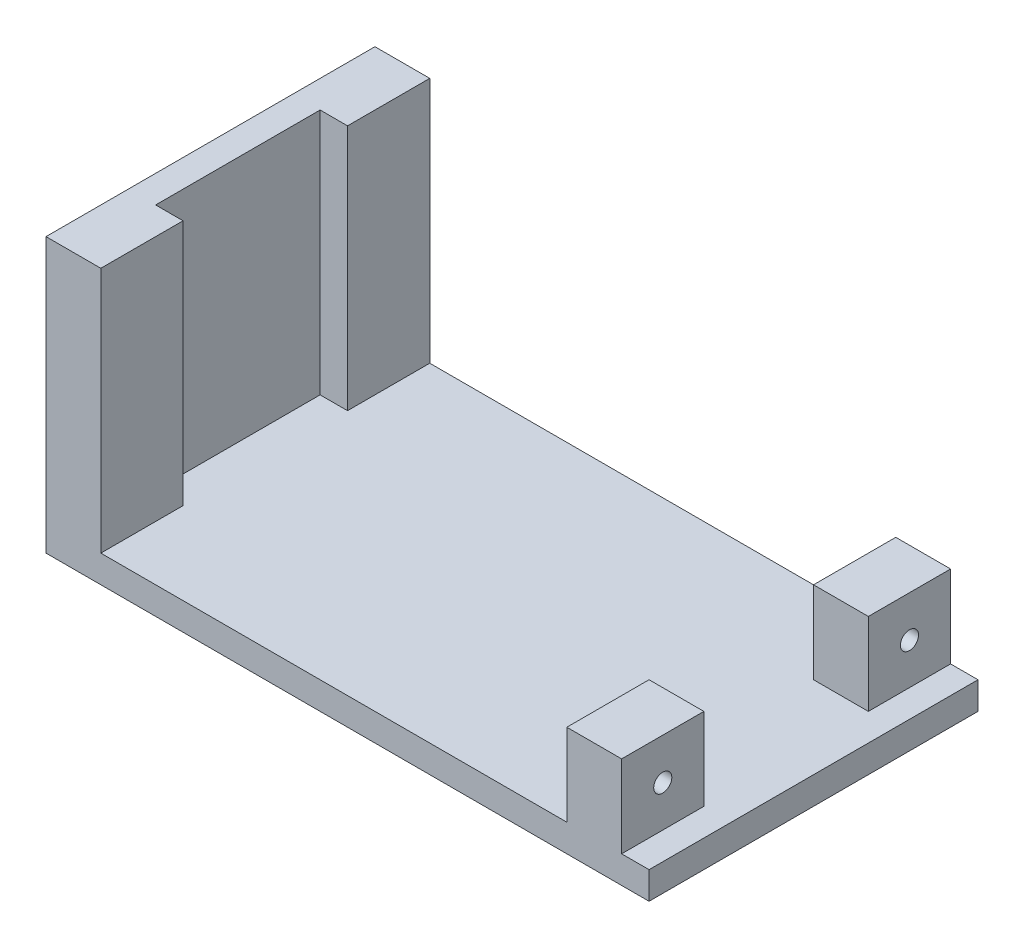
ISO-10303-21;
HEADER;
FILE_DESCRIPTION(('STEP AP214'),'2;1');
FILE_NAME('part.step','',(''),(''),'','','');
FILE_SCHEMA(('AUTOMOTIVE_DESIGN { 1 0 10303 214 1 1 1 1 }'));
ENDSEC;
DATA;
#1=APPLICATION_CONTEXT('core data for automotive mechanical design processes');
#2=APPLICATION_PROTOCOL_DEFINITION('international standard','automotive_design',2000,#1);
#3=PRODUCT_CONTEXT('',#1,'mechanical');
#4=PRODUCT('Part','Part','',(#3));
#5=PRODUCT_RELATED_PRODUCT_CATEGORY('part','',(#4));
#6=PRODUCT_DEFINITION_FORMATION('','',#4);
#7=PRODUCT_DEFINITION_CONTEXT('part definition',#1,'design');
#8=PRODUCT_DEFINITION('design','',#6,#7);
#9=PRODUCT_DEFINITION_SHAPE('','',#8);
#10=(LENGTH_UNIT() NAMED_UNIT(*) SI_UNIT(.MILLI.,.METRE.));
#11=(NAMED_UNIT(*) PLANE_ANGLE_UNIT() SI_UNIT($,.RADIAN.));
#12=(NAMED_UNIT(*) SI_UNIT($,.STERADIAN.) SOLID_ANGLE_UNIT());
#13=UNCERTAINTY_MEASURE_WITH_UNIT(LENGTH_MEASURE(1.E-05),#10,'distance_accuracy_value','');
#14=(GEOMETRIC_REPRESENTATION_CONTEXT(3) GLOBAL_UNCERTAINTY_ASSIGNED_CONTEXT((#13)) GLOBAL_UNIT_ASSIGNED_CONTEXT((#10,
#11,#12)) REPRESENTATION_CONTEXT('',''));
#15=CARTESIAN_POINT('',(0.,0.,0.));
#16=DIRECTION('',(0.,0.,1.));
#17=DIRECTION('',(1.,0.,0.));
#18=AXIS2_PLACEMENT_3D('',#15,#16,#17);
#19=CARTESIAN_POINT('',(0.,5.,0.));
#20=DIRECTION('',(1.,0.,0.));
#21=DIRECTION('',(0.,0.,-1.));
#22=AXIS2_PLACEMENT_3D('',#19,#20,#21);
#23=PLANE('',#22);
#24=DIRECTION('',(0.,1.,0.));
#25=VECTOR('',#24,1.);
#26=CARTESIAN_POINT('',(0.,34.,-45.));
#27=LINE('',#26,#25);
#28=CARTESIAN_POINT('',(0.,30.,-45.));
#29=VERTEX_POINT('',#28);
#30=CARTESIAN_POINT('',(0.,34.,-45.));
#31=VERTEX_POINT('',#30);
#32=EDGE_CURVE('E289',#29,#31,#27,.T.);
#33=ORIENTED_EDGE('',*,*,#32,.F.);
#34=DIRECTION('',(0.,0.,1.));
#35=VECTOR('',#34,1.);
#36=CARTESIAN_POINT('',(0.,30.,-50.));
#37=LINE('',#36,#35);
#38=CARTESIAN_POINT('',(0.,30.,-50.));
#39=VERTEX_POINT('',#38);
#40=EDGE_CURVE('E294',#39,#29,#37,.T.);
#41=ORIENTED_EDGE('',*,*,#40,.F.);
#42=DIRECTION('',(0.,-1.,0.));
#43=VECTOR('',#42,1.);
#44=CARTESIAN_POINT('',(0.,34.,-50.));
#45=LINE('',#44,#43);
#46=CARTESIAN_POINT('',(0.,34.,-50.));
#47=VERTEX_POINT('',#46);
#48=EDGE_CURVE('E223',#47,#39,#45,.T.);
#49=ORIENTED_EDGE('',*,*,#48,.F.);
#50=DIRECTION('',(0.,0.,-1.));
#51=VECTOR('',#50,1.);
#52=CARTESIAN_POINT('',(0.,34.,-50.));
#53=LINE('',#52,#51);
#54=EDGE_CURVE('E298',#31,#47,#53,.T.);
#55=ORIENTED_EDGE('',*,*,#54,.F.);
#56=EDGE_LOOP('',(#33,#41,#49,#55));
#57=FACE_BOUND('',#56,.T.);
#58=DIRECTION('',(0.,0.,1.));
#59=VECTOR('',#58,1.);
#60=CARTESIAN_POINT('',(0.,0.,0.));
#61=LINE('',#60,#59);
#62=CARTESIAN_POINT('',(0.,0.,-60.));
#63=VERTEX_POINT('',#62);
#64=CARTESIAN_POINT('',(0.,0.,0.));
#65=VERTEX_POINT('',#64);
#66=EDGE_CURVE('E486',#63,#65,#61,.T.);
#67=ORIENTED_EDGE('',*,*,#66,.T.);
#68=DIRECTION('',(0.,-1.,0.));
#69=VECTOR('',#68,1.);
#70=CARTESIAN_POINT('',(0.,5.,0.));
#71=LINE('',#70,#69);
#72=CARTESIAN_POINT('',(0.,50.,0.));
#73=VERTEX_POINT('',#72);
#74=EDGE_CURVE('E11',#73,#65,#71,.T.);
#75=ORIENTED_EDGE('',*,*,#74,.F.);
#76=DIRECTION('',(0.,0.,1.));
#77=VECTOR('',#76,1.);
#78=CARTESIAN_POINT('',(0.,50.,0.));
#79=LINE('',#78,#77);
#80=CARTESIAN_POINT('',(0.,50.,-60.));
#81=VERTEX_POINT('',#80);
#82=EDGE_CURVE('E417',#81,#73,#79,.T.);
#83=ORIENTED_EDGE('',*,*,#82,.F.);
#84=DIRECTION('',(0.,-1.,0.));
#85=VECTOR('',#84,1.);
#86=CARTESIAN_POINT('',(0.,5.,-60.));
#87=LINE('',#86,#85);
#88=EDGE_CURVE('E497',#81,#63,#87,.T.);
#89=ORIENTED_EDGE('',*,*,#88,.T.);
#90=EDGE_LOOP('',(#67,#75,#83,#89));
#91=FACE_BOUND('',#90,.T.);
#92=DIRECTION('',(0.,0.,-1.));
#93=VECTOR('',#92,1.);
#94=CARTESIAN_POINT('',(0.,34.,-10.));
#95=LINE('',#94,#93);
#96=CARTESIAN_POINT('',(0.,34.,-10.));
#97=VERTEX_POINT('',#96);
#98=CARTESIAN_POINT('',(0.,34.,-15.));
#99=VERTEX_POINT('',#98);
#100=EDGE_CURVE('E257',#97,#99,#95,.T.);
#101=ORIENTED_EDGE('',*,*,#100,.F.);
#102=DIRECTION('',(0.,1.,0.));
#103=VECTOR('',#102,1.);
#104=CARTESIAN_POINT('',(0.,34.,-10.));
#105=LINE('',#104,#103);
#106=CARTESIAN_POINT('',(0.,30.,-10.));
#107=VERTEX_POINT('',#106);
#108=EDGE_CURVE('E266',#107,#97,#105,.T.);
#109=ORIENTED_EDGE('',*,*,#108,.F.);
#110=DIRECTION('',(0.,0.,1.));
#111=VECTOR('',#110,1.);
#112=CARTESIAN_POINT('',(0.,30.,-10.));
#113=LINE('',#112,#111);
#114=CARTESIAN_POINT('',(0.,30.,-15.));
#115=VERTEX_POINT('',#114);
#116=EDGE_CURVE('E65',#115,#107,#113,.T.);
#117=ORIENTED_EDGE('',*,*,#116,.F.);
#118=DIRECTION('',(0.,-1.,0.));
#119=VECTOR('',#118,1.);
#120=CARTESIAN_POINT('',(0.,34.,-15.));
#121=LINE('',#120,#119);
#122=EDGE_CURVE('E60',#99,#115,#121,.T.);
#123=ORIENTED_EDGE('',*,*,#122,.F.);
#124=EDGE_LOOP('',(#101,#109,#117,#123));
#125=FACE_BOUND('',#124,.T.);
#126=ADVANCED_FACE('F45',(#57,#91,#125),#23,.F.);
#127=CARTESIAN_POINT('',(110.,20.,-15.));
#128=DIRECTION('',(0.,0.,1.));
#129=DIRECTION('',(1.,0.,0.));
#130=AXIS2_PLACEMENT_3D('',#127,#128,#129);
#131=PLANE('',#130);
#132=DIRECTION('',(0.,1.,0.));
#133=VECTOR('',#132,1.);
#134=CARTESIAN_POINT('',(105.,5.,-15.));
#135=LINE('',#134,#133);
#136=CARTESIAN_POINT('',(105.,5.,-15.));
#137=VERTEX_POINT('',#136);
#138=CARTESIAN_POINT('',(105.,20.,-15.));
#139=VERTEX_POINT('',#138);
#140=EDGE_CURVE('E332',#137,#139,#135,.T.);
#141=ORIENTED_EDGE('',*,*,#140,.F.);
#142=DIRECTION('',(-1.,0.,0.));
#143=VECTOR('',#142,1.);
#144=CARTESIAN_POINT('',(110.,5.,-15.));
#145=LINE('',#144,#143);
#146=CARTESIAN_POINT('',(95.,5.,-15.));
#147=VERTEX_POINT('',#146);
#148=EDGE_CURVE('E349',#137,#147,#145,.T.);
#149=ORIENTED_EDGE('',*,*,#148,.T.);
#150=DIRECTION('',(0.,-1.,0.));
#151=VECTOR('',#150,1.);
#152=CARTESIAN_POINT('',(95.,20.,-15.));
#153=LINE('',#152,#151);
#154=CARTESIAN_POINT('',(95.,20.,-15.));
#155=VERTEX_POINT('',#154);
#156=EDGE_CURVE('E386',#155,#147,#153,.T.);
#157=ORIENTED_EDGE('',*,*,#156,.F.);
#158=DIRECTION('',(-1.,0.,0.));
#159=VECTOR('',#158,1.);
#160=CARTESIAN_POINT('',(110.,20.,-15.));
#161=LINE('',#160,#159);
#162=EDGE_CURVE('E366',#139,#155,#161,.T.);
#163=ORIENTED_EDGE('',*,*,#162,.F.);
#164=EDGE_LOOP('',(#141,#149,#157,#163));
#165=FACE_BOUND('',#164,.T.);
#166=ADVANCED_FACE('F576',(#165),#131,.F.);
#167=CARTESIAN_POINT('',(0.,20.,0.));
#168=DIRECTION('',(0.,1.,0.));
#169=DIRECTION('',(0.,0.,1.));
#170=AXIS2_PLACEMENT_3D('',#167,#168,#169);
#171=PLANE('',#170);
#172=DIRECTION('',(1.,0.,0.));
#173=VECTOR('',#172,1.);
#174=CARTESIAN_POINT('',(110.,20.,0.));
#175=LINE('',#174,#173);
#176=CARTESIAN_POINT('',(95.,20.,0.));
#177=VERTEX_POINT('',#176);
#178=CARTESIAN_POINT('',(105.,20.,0.));
#179=VERTEX_POINT('',#178);
#180=EDGE_CURVE('E373',#177,#179,#175,.T.);
#181=ORIENTED_EDGE('',*,*,#180,.T.);
#182=DIRECTION('',(0.,0.,1.));
#183=VECTOR('',#182,1.);
#184=CARTESIAN_POINT('',(105.,20.,-15.));
#185=LINE('',#184,#183);
#186=EDGE_CURVE('E335',#139,#179,#185,.T.);
#187=ORIENTED_EDGE('',*,*,#186,.F.);
#188=ORIENTED_EDGE('',*,*,#162,.T.);
#189=DIRECTION('',(0.,0.,1.));
#190=VECTOR('',#189,1.);
#191=CARTESIAN_POINT('',(95.,20.,0.));
#192=LINE('',#191,#190);
#193=EDGE_CURVE('E369',#155,#177,#192,.T.);
#194=ORIENTED_EDGE('',*,*,#193,.T.);
#195=EDGE_LOOP('',(#181,#187,#188,#194));
#196=FACE_BOUND('',#195,.T.);
#197=ADVANCED_FACE('F582',(#196),#171,.T.);
#198=CARTESIAN_POINT('',(0.,5.,0.));
#199=DIRECTION('',(0.,-1.,0.));
#200=DIRECTION('',(0.,0.,-1.));
#201=AXIS2_PLACEMENT_3D('',#198,#199,#200);
#202=PLANE('',#201);
#203=ORIENTED_EDGE('',*,*,#148,.F.);
#204=DIRECTION('',(0.,0.,-1.));
#205=VECTOR('',#204,1.);
#206=CARTESIAN_POINT('',(105.,5.,-15.));
#207=LINE('',#206,#205);
#208=CARTESIAN_POINT('',(105.,5.,0.));
#209=VERTEX_POINT('',#208);
#210=EDGE_CURVE('E342',#209,#137,#207,.T.);
#211=ORIENTED_EDGE('',*,*,#210,.F.);
#212=DIRECTION('',(1.,0.,0.));
#213=VECTOR('',#212,1.);
#214=CARTESIAN_POINT('',(105.,5.,0.));
#215=LINE('',#214,#213);
#216=CARTESIAN_POINT('',(110.,5.,0.));
#217=VERTEX_POINT('',#216);
#218=EDGE_CURVE('E345',#209,#217,#215,.T.);
#219=ORIENTED_EDGE('',*,*,#218,.T.);
#220=DIRECTION('',(0.,0.,-1.));
#221=VECTOR('',#220,1.);
#222=CARTESIAN_POINT('',(110.,5.,0.));
#223=LINE('',#222,#221);
#224=CARTESIAN_POINT('',(110.,5.,-60.));
#225=VERTEX_POINT('',#224);
#226=EDGE_CURVE('E490',#217,#225,#223,.T.);
#227=ORIENTED_EDGE('',*,*,#226,.T.);
#228=DIRECTION('',(1.,0.,0.));
#229=VECTOR('',#228,1.);
#230=CARTESIAN_POINT('',(105.,5.,-60.));
#231=LINE('',#230,#229);
#232=CARTESIAN_POINT('',(105.,5.,-60.));
#233=VERTEX_POINT('',#232);
#234=EDGE_CURVE('E336',#233,#225,#231,.T.);
#235=ORIENTED_EDGE('',*,*,#234,.F.);
#236=DIRECTION('',(0.,0.,-1.));
#237=VECTOR('',#236,1.);
#238=CARTESIAN_POINT('',(105.,5.,-45.));
#239=LINE('',#238,#237);
#240=CARTESIAN_POINT('',(105.,5.,-45.));
#241=VERTEX_POINT('',#240);
#242=EDGE_CURVE('E353',#241,#233,#239,.T.);
#243=ORIENTED_EDGE('',*,*,#242,.F.);
#244=DIRECTION('',(1.,0.,0.));
#245=VECTOR('',#244,1.);
#246=CARTESIAN_POINT('',(110.,5.,-45.));
#247=LINE('',#246,#245);
#248=CARTESIAN_POINT('',(95.,5.,-45.));
#249=VERTEX_POINT('',#248);
#250=EDGE_CURVE('E395',#249,#241,#247,.T.);
#251=ORIENTED_EDGE('',*,*,#250,.F.);
#252=DIRECTION('',(0.,0.,1.));
#253=VECTOR('',#252,1.);
#254=CARTESIAN_POINT('',(94.9999999999999,5.,-60.));
#255=LINE('',#254,#253);
#256=CARTESIAN_POINT('',(94.9999999999999,5.,-60.));
#257=VERTEX_POINT('',#256);
#258=EDGE_CURVE('E390',#257,#249,#255,.T.);
#259=ORIENTED_EDGE('',*,*,#258,.F.);
#260=DIRECTION('',(-1.,0.,0.));
#261=VECTOR('',#260,1.);
#262=CARTESIAN_POINT('',(0.,5.,-60.));
#263=LINE('',#262,#261);
#264=CARTESIAN_POINT('',(10.,5.,-60.));
#265=VERTEX_POINT('',#264);
#266=EDGE_CURVE('E494',#257,#265,#263,.T.);
#267=ORIENTED_EDGE('',*,*,#266,.T.);
#268=DIRECTION('',(0.,0.,-1.));
#269=VECTOR('',#268,1.);
#270=CARTESIAN_POINT('',(10.,5.,-45.));
#271=LINE('',#270,#269);
#272=CARTESIAN_POINT('',(10.,5.,-45.));
#273=VERTEX_POINT('',#272);
#274=EDGE_CURVE('E422',#273,#265,#271,.T.);
#275=ORIENTED_EDGE('',*,*,#274,.F.);
#276=DIRECTION('',(1.,0.,0.));
#277=VECTOR('',#276,1.);
#278=CARTESIAN_POINT('',(10.,5.,-45.));
#279=LINE('',#278,#277);
#280=CARTESIAN_POINT('',(5.,5.,-45.));
#281=VERTEX_POINT('',#280);
#282=EDGE_CURVE('E456',#281,#273,#279,.T.);
#283=ORIENTED_EDGE('',*,*,#282,.F.);
#284=DIRECTION('',(0.,0.,-1.));
#285=VECTOR('',#284,1.);
#286=CARTESIAN_POINT('',(5.,5.,-45.));
#287=LINE('',#286,#285);
#288=CARTESIAN_POINT('',(5.,5.,-15.));
#289=VERTEX_POINT('',#288);
#290=EDGE_CURVE('E452',#289,#281,#287,.T.);
#291=ORIENTED_EDGE('',*,*,#290,.F.);
#292=DIRECTION('',(-1.,0.,0.));
#293=VECTOR('',#292,1.);
#294=CARTESIAN_POINT('',(5.,5.,-15.));
#295=LINE('',#294,#293);
#296=CARTESIAN_POINT('',(10.,5.,-15.));
#297=VERTEX_POINT('',#296);
#298=EDGE_CURVE('E448',#297,#289,#295,.T.);
#299=ORIENTED_EDGE('',*,*,#298,.F.);
#300=DIRECTION('',(0.,0.,-1.));
#301=VECTOR('',#300,1.);
#302=CARTESIAN_POINT('',(10.,5.,0.));
#303=LINE('',#302,#301);
#304=CARTESIAN_POINT('',(10.,5.,0.));
#305=VERTEX_POINT('',#304);
#306=EDGE_CURVE('E416',#305,#297,#303,.T.);
#307=ORIENTED_EDGE('',*,*,#306,.F.);
#308=DIRECTION('',(1.,0.,0.));
#309=VECTOR('',#308,1.);
#310=CARTESIAN_POINT('',(0.,5.,0.));
#311=LINE('',#310,#309);
#312=CARTESIAN_POINT('',(95.,5.,0.));
#313=VERTEX_POINT('',#312);
#314=EDGE_CURVE('E487',#305,#313,#311,.T.);
#315=ORIENTED_EDGE('',*,*,#314,.T.);
#316=DIRECTION('',(0.,0.,1.));
#317=VECTOR('',#316,1.);
#318=CARTESIAN_POINT('',(95.,5.,0.));
#319=LINE('',#318,#317);
#320=EDGE_CURVE('E370',#147,#313,#319,.T.);
#321=ORIENTED_EDGE('',*,*,#320,.F.);
#322=EDGE_LOOP('',(#203,#211,#219,#227,#235,#243,#251,#259,#267,#275,#283,#291,#299,#307,#315,#321));
#323=FACE_BOUND('',#322,.T.);
#324=ADVANCED_FACE('F548',(#323),#202,.F.);
#325=CARTESIAN_POINT('',(0.,5.,0.));
#326=DIRECTION('',(0.,0.,-1.));
#327=DIRECTION('',(-1.,0.,0.));
#328=AXIS2_PLACEMENT_3D('',#325,#326,#327);
#329=PLANE('',#328);
#330=DIRECTION('',(0.,-1.,0.));
#331=VECTOR('',#330,1.);
#332=CARTESIAN_POINT('',(110.,5.,0.));
#333=LINE('',#332,#331);
#334=CARTESIAN_POINT('',(110.,0.,0.));
#335=VERTEX_POINT('',#334);
#336=EDGE_CURVE('E53',#217,#335,#333,.T.);
#337=ORIENTED_EDGE('',*,*,#336,.F.);
#338=ORIENTED_EDGE('',*,*,#218,.F.);
#339=DIRECTION('',(0.,-1.,0.));
#340=VECTOR('',#339,1.);
#341=CARTESIAN_POINT('',(105.,5.,0.));
#342=LINE('',#341,#340);
#343=EDGE_CURVE('E339',#179,#209,#342,.T.);
#344=ORIENTED_EDGE('',*,*,#343,.F.);
#345=ORIENTED_EDGE('',*,*,#180,.F.);
#346=DIRECTION('',(0.,-1.,0.));
#347=VECTOR('',#346,1.);
#348=CARTESIAN_POINT('',(95.,20.,0.));
#349=LINE('',#348,#347);
#350=EDGE_CURVE('E377',#177,#313,#349,.T.);
#351=ORIENTED_EDGE('',*,*,#350,.T.);
#352=ORIENTED_EDGE('',*,*,#314,.F.);
#353=DIRECTION('',(0.,-1.,0.));
#354=VECTOR('',#353,1.);
#355=CARTESIAN_POINT('',(10.,50.,0.));
#356=LINE('',#355,#354);
#357=CARTESIAN_POINT('',(10.,50.,0.));
#358=VERTEX_POINT('',#357);
#359=EDGE_CURVE('E482',#358,#305,#356,.T.);
#360=ORIENTED_EDGE('',*,*,#359,.F.);
#361=DIRECTION('',(1.,0.,0.));
#362=VECTOR('',#361,1.);
#363=CARTESIAN_POINT('',(0.,50.,0.));
#364=LINE('',#363,#362);
#365=EDGE_CURVE('E421',#73,#358,#364,.T.);
#366=ORIENTED_EDGE('',*,*,#365,.F.);
#367=ORIENTED_EDGE('',*,*,#74,.T.);
#368=DIRECTION('',(1.,0.,0.));
#369=VECTOR('',#368,1.);
#370=CARTESIAN_POINT('',(0.,0.,0.));
#371=LINE('',#370,#369);
#372=EDGE_CURVE('E501',#65,#335,#371,.T.);
#373=ORIENTED_EDGE('',*,*,#372,.T.);
#374=EDGE_LOOP('',(#337,#338,#344,#345,#351,#352,#360,#366,#367,#373));
#375=FACE_BOUND('',#374,.T.);
#376=ADVANCED_FACE('F525',(#375),#329,.F.);
#377=CARTESIAN_POINT('',(110.,5.,0.));
#378=DIRECTION('',(-1.,0.,0.));
#379=DIRECTION('',(0.,0.,1.));
#380=AXIS2_PLACEMENT_3D('',#377,#378,#379);
#381=PLANE('',#380);
#382=ORIENTED_EDGE('',*,*,#226,.F.);
#383=ORIENTED_EDGE('',*,*,#336,.T.);
#384=DIRECTION('',(0.,0.,-1.));
#385=VECTOR('',#384,1.);
#386=CARTESIAN_POINT('',(110.,0.,0.));
#387=LINE('',#386,#385);
#388=CARTESIAN_POINT('',(110.,0.,-60.));
#389=VERTEX_POINT('',#388);
#390=EDGE_CURVE('E505',#335,#389,#387,.T.);
#391=ORIENTED_EDGE('',*,*,#390,.T.);
#392=DIRECTION('',(0.,-1.,0.));
#393=VECTOR('',#392,1.);
#394=CARTESIAN_POINT('',(110.,5.,-60.));
#395=LINE('',#394,#393);
#396=EDGE_CURVE('E514',#225,#389,#395,.T.);
#397=ORIENTED_EDGE('',*,*,#396,.F.);
#398=EDGE_LOOP('',(#382,#383,#391,#397));
#399=FACE_BOUND('',#398,.T.);
#400=ADVANCED_FACE('F519',(#399),#381,.F.);
#401=CARTESIAN_POINT('',(0.,5.,-60.));
#402=DIRECTION('',(0.,0.,1.));
#403=DIRECTION('',(1.,0.,0.));
#404=AXIS2_PLACEMENT_3D('',#401,#402,#403);
#405=PLANE('',#404);
#406=DIRECTION('',(0.,1.,0.));
#407=VECTOR('',#406,1.);
#408=CARTESIAN_POINT('',(105.,5.,-60.));
#409=LINE('',#408,#407);
#410=CARTESIAN_POINT('',(105.,20.,-60.));
#411=VERTEX_POINT('',#410);
#412=EDGE_CURVE('E357',#233,#411,#409,.T.);
#413=ORIENTED_EDGE('',*,*,#412,.F.);
#414=ORIENTED_EDGE('',*,*,#234,.T.);
#415=ORIENTED_EDGE('',*,*,#396,.T.);
#416=DIRECTION('',(-1.,0.,0.));
#417=VECTOR('',#416,1.);
#418=CARTESIAN_POINT('',(0.,0.,-60.));
#419=LINE('',#418,#417);
#420=EDGE_CURVE('E491',#389,#63,#419,.T.);
#421=ORIENTED_EDGE('',*,*,#420,.T.);
#422=ORIENTED_EDGE('',*,*,#88,.F.);
#423=DIRECTION('',(-1.,0.,0.));
#424=VECTOR('',#423,1.);
#425=CARTESIAN_POINT('',(0.,50.,-60.));
#426=LINE('',#425,#424);
#427=CARTESIAN_POINT('',(10.,50.,-60.));
#428=VERTEX_POINT('',#427);
#429=EDGE_CURVE('E440',#428,#81,#426,.T.);
#430=ORIENTED_EDGE('',*,*,#429,.F.);
#431=DIRECTION('',(0.,-1.,0.));
#432=VECTOR('',#431,1.);
#433=CARTESIAN_POINT('',(10.,50.,-60.));
#434=LINE('',#433,#432);
#435=EDGE_CURVE('E444',#428,#265,#434,.T.);
#436=ORIENTED_EDGE('',*,*,#435,.T.);
#437=ORIENTED_EDGE('',*,*,#266,.F.);
#438=DIRECTION('',(0.,-1.,0.));
#439=VECTOR('',#438,1.);
#440=CARTESIAN_POINT('',(94.9999999999999,20.,-60.));
#441=LINE('',#440,#439);
#442=CARTESIAN_POINT('',(94.9999999999999,20.,-60.));
#443=VERTEX_POINT('',#442);
#444=EDGE_CURVE('E412',#443,#257,#441,.T.);
#445=ORIENTED_EDGE('',*,*,#444,.F.);
#446=DIRECTION('',(-1.,0.,0.));
#447=VECTOR('',#446,1.);
#448=CARTESIAN_POINT('',(110.,20.,-60.));
#449=LINE('',#448,#447);
#450=EDGE_CURVE('E391',#411,#443,#449,.T.);
#451=ORIENTED_EDGE('',*,*,#450,.F.);
#452=EDGE_LOOP('',(#413,#414,#415,#421,#422,#430,#436,#437,#445,#451));
#453=FACE_BOUND('',#452,.T.);
#454=ADVANCED_FACE('F532',(#453),#405,.F.);
#455=CARTESIAN_POINT('',(0.,0.,0.));
#456=DIRECTION('',(0.,-1.,0.));
#457=DIRECTION('',(0.,0.,-1.));
#458=AXIS2_PLACEMENT_3D('',#455,#456,#457);
#459=PLANE('',#458);
#460=ORIENTED_EDGE('',*,*,#66,.F.);
#461=ORIENTED_EDGE('',*,*,#420,.F.);
#462=ORIENTED_EDGE('',*,*,#390,.F.);
#463=ORIENTED_EDGE('',*,*,#372,.F.);
#464=EDGE_LOOP('',(#460,#461,#462,#463));
#465=FACE_BOUND('',#464,.T.);
#466=ADVANCED_FACE('F529',(#465),#459,.T.);
#467=CARTESIAN_POINT('',(10.,50.,0.));
#468=DIRECTION('',(-1.,0.,0.));
#469=DIRECTION('',(0.,0.,1.));
#470=AXIS2_PLACEMENT_3D('',#467,#468,#469);
#471=PLANE('',#470);
#472=ORIENTED_EDGE('',*,*,#306,.T.);
#473=DIRECTION('',(0.,-1.,0.));
#474=VECTOR('',#473,1.);
#475=CARTESIAN_POINT('',(10.,50.,-15.));
#476=LINE('',#475,#474);
#477=CARTESIAN_POINT('',(10.,50.,-15.));
#478=VERTEX_POINT('',#477);
#479=EDGE_CURVE('E478',#478,#297,#476,.T.);
#480=ORIENTED_EDGE('',*,*,#479,.F.);
#481=DIRECTION('',(0.,0.,-1.));
#482=VECTOR('',#481,1.);
#483=CARTESIAN_POINT('',(10.,50.,0.));
#484=LINE('',#483,#482);
#485=EDGE_CURVE('E425',#358,#478,#484,.T.);
#486=ORIENTED_EDGE('',*,*,#485,.F.);
#487=ORIENTED_EDGE('',*,*,#359,.T.);
#488=EDGE_LOOP('',(#472,#480,#486,#487));
#489=FACE_BOUND('',#488,.T.);
#490=ADVANCED_FACE('F563',(#489),#471,.F.);
#491=CARTESIAN_POINT('',(5.,50.,-15.));
#492=DIRECTION('',(0.,0.,1.));
#493=DIRECTION('',(1.,0.,0.));
#494=AXIS2_PLACEMENT_3D('',#491,#492,#493);
#495=PLANE('',#494);
#496=ORIENTED_EDGE('',*,*,#298,.T.);
#497=DIRECTION('',(0.,-1.,0.));
#498=VECTOR('',#497,1.);
#499=CARTESIAN_POINT('',(5.,50.,-15.));
#500=LINE('',#499,#498);
#501=CARTESIAN_POINT('',(5.,50.,-15.));
#502=VERTEX_POINT('',#501);
#503=EDGE_CURVE('E474',#502,#289,#500,.T.);
#504=ORIENTED_EDGE('',*,*,#503,.F.);
#505=DIRECTION('',(-1.,0.,0.));
#506=VECTOR('',#505,1.);
#507=CARTESIAN_POINT('',(5.,50.,-15.));
#508=LINE('',#507,#506);
#509=EDGE_CURVE('E428',#478,#502,#508,.T.);
#510=ORIENTED_EDGE('',*,*,#509,.F.);
#511=ORIENTED_EDGE('',*,*,#479,.T.);
#512=EDGE_LOOP('',(#496,#504,#510,#511));
#513=FACE_BOUND('',#512,.T.);
#514=ADVANCED_FACE('F558',(#513),#495,.F.);
#515=CARTESIAN_POINT('',(5.,50.,-45.));
#516=DIRECTION('',(-1.,0.,0.));
#517=DIRECTION('',(0.,0.,1.));
#518=AXIS2_PLACEMENT_3D('',#515,#516,#517);
#519=PLANE('',#518);
#520=ORIENTED_EDGE('',*,*,#290,.T.);
#521=DIRECTION('',(0.,-1.,0.));
#522=VECTOR('',#521,1.);
#523=CARTESIAN_POINT('',(5.,50.,-45.));
#524=LINE('',#523,#522);
#525=CARTESIAN_POINT('',(5.,50.,-45.));
#526=VERTEX_POINT('',#525);
#527=EDGE_CURVE('E470',#526,#281,#524,.T.);
#528=ORIENTED_EDGE('',*,*,#527,.F.);
#529=DIRECTION('',(0.,0.,-1.));
#530=VECTOR('',#529,1.);
#531=CARTESIAN_POINT('',(5.,50.,-45.));
#532=LINE('',#531,#530);
#533=EDGE_CURVE('E431',#502,#526,#532,.T.);
#534=ORIENTED_EDGE('',*,*,#533,.F.);
#535=ORIENTED_EDGE('',*,*,#503,.T.);
#536=EDGE_LOOP('',(#520,#528,#534,#535));
#537=FACE_BOUND('',#536,.T.);
#538=ADVANCED_FACE('F555',(#537),#519,.F.);
#539=CARTESIAN_POINT('',(10.,50.,-45.));
#540=DIRECTION('',(0.,0.,-1.));
#541=DIRECTION('',(-1.,0.,0.));
#542=AXIS2_PLACEMENT_3D('',#539,#540,#541);
#543=PLANE('',#542);
#544=ORIENTED_EDGE('',*,*,#282,.T.);
#545=DIRECTION('',(0.,-1.,0.));
#546=VECTOR('',#545,1.);
#547=CARTESIAN_POINT('',(10.,50.,-45.));
#548=LINE('',#547,#546);
#549=CARTESIAN_POINT('',(10.,50.,-45.));
#550=VERTEX_POINT('',#549);
#551=EDGE_CURVE('E466',#550,#273,#548,.T.);
#552=ORIENTED_EDGE('',*,*,#551,.F.);
#553=DIRECTION('',(1.,0.,0.));
#554=VECTOR('',#553,1.);
#555=CARTESIAN_POINT('',(10.,50.,-45.));
#556=LINE('',#555,#554);
#557=EDGE_CURVE('E434',#526,#550,#556,.T.);
#558=ORIENTED_EDGE('',*,*,#557,.F.);
#559=ORIENTED_EDGE('',*,*,#527,.T.);
#560=EDGE_LOOP('',(#544,#552,#558,#559));
#561=FACE_BOUND('',#560,.T.);
#562=ADVANCED_FACE('F550',(#561),#543,.F.);
#563=CARTESIAN_POINT('',(10.,50.,-45.));
#564=DIRECTION('',(-1.,0.,0.));
#565=DIRECTION('',(0.,0.,1.));
#566=AXIS2_PLACEMENT_3D('',#563,#564,#565);
#567=PLANE('',#566);
#568=ORIENTED_EDGE('',*,*,#274,.T.);
#569=ORIENTED_EDGE('',*,*,#435,.F.);
#570=DIRECTION('',(0.,0.,-1.));
#571=VECTOR('',#570,1.);
#572=CARTESIAN_POINT('',(10.,50.,-45.));
#573=LINE('',#572,#571);
#574=EDGE_CURVE('E437',#550,#428,#573,.T.);
#575=ORIENTED_EDGE('',*,*,#574,.F.);
#576=ORIENTED_EDGE('',*,*,#551,.T.);
#577=EDGE_LOOP('',(#568,#569,#575,#576));
#578=FACE_BOUND('',#577,.T.);
#579=ADVANCED_FACE('F544',(#578),#567,.F.);
#580=CARTESIAN_POINT('',(0.,50.,0.));
#581=DIRECTION('',(0.,-1.,0.));
#582=DIRECTION('',(0.,0.,-1.));
#583=AXIS2_PLACEMENT_3D('',#580,#581,#582);
#584=PLANE('',#583);
#585=ORIENTED_EDGE('',*,*,#82,.T.);
#586=ORIENTED_EDGE('',*,*,#365,.T.);
#587=ORIENTED_EDGE('',*,*,#485,.T.);
#588=ORIENTED_EDGE('',*,*,#509,.T.);
#589=ORIENTED_EDGE('',*,*,#533,.T.);
#590=ORIENTED_EDGE('',*,*,#557,.T.);
#591=ORIENTED_EDGE('',*,*,#574,.T.);
#592=ORIENTED_EDGE('',*,*,#429,.T.);
#593=EDGE_LOOP('',(#585,#586,#587,#588,#589,#590,#591,#592));
#594=FACE_BOUND('',#593,.T.);
#595=ADVANCED_FACE('F537',(#594),#584,.F.);
#596=CARTESIAN_POINT('',(94.9999999999999,20.,-60.));
#597=DIRECTION('',(1.,0.,0.));
#598=DIRECTION('',(0.,0.,-1.));
#599=AXIS2_PLACEMENT_3D('',#596,#597,#598);
#600=PLANE('',#599);
#601=CARTESIAN_POINT('',(94.9999999999999,12.5,-52.5));
#602=DIRECTION('',(1.,0.,0.));
#603=DIRECTION('',(0.,0.,-1.));
#604=AXIS2_PLACEMENT_3D('',#601,#602,#603);
#605=CIRCLE('',#604,1.65);
#606=CARTESIAN_POINT('',(94.9999999999999,12.5,-54.15));
#607=VERTEX_POINT('',#606);
#608=EDGE_CURVE('E327',#607,#607,#605,.T.);
#609=ORIENTED_EDGE('',*,*,#608,.T.);
#610=EDGE_LOOP('',(#609));
#611=FACE_BOUND('',#610,.T.);
#612=ORIENTED_EDGE('',*,*,#258,.T.);
#613=DIRECTION('',(0.,-1.,0.));
#614=VECTOR('',#613,1.);
#615=CARTESIAN_POINT('',(95.,20.,-45.));
#616=LINE('',#615,#614);
#617=CARTESIAN_POINT('',(95.,20.,-45.));
#618=VERTEX_POINT('',#617);
#619=EDGE_CURVE('E402',#618,#249,#616,.T.);
#620=ORIENTED_EDGE('',*,*,#619,.F.);
#621=DIRECTION('',(0.,0.,1.));
#622=VECTOR('',#621,1.);
#623=CARTESIAN_POINT('',(94.9999999999999,20.,-60.));
#624=LINE('',#623,#622);
#625=EDGE_CURVE('E394',#443,#618,#624,.T.);
#626=ORIENTED_EDGE('',*,*,#625,.F.);
#627=ORIENTED_EDGE('',*,*,#444,.T.);
#628=EDGE_LOOP('',(#612,#620,#626,#627));
#629=FACE_BOUND('',#628,.T.);
#630=ADVANCED_FACE('F656',(#611,#629),#600,.F.);
#631=CARTESIAN_POINT('',(110.,20.,-45.));
#632=DIRECTION('',(0.,0.,-1.));
#633=DIRECTION('',(-1.,0.,0.));
#634=AXIS2_PLACEMENT_3D('',#631,#632,#633);
#635=PLANE('',#634);
#636=ORIENTED_EDGE('',*,*,#250,.T.);
#637=DIRECTION('',(0.,-1.,0.));
#638=VECTOR('',#637,1.);
#639=CARTESIAN_POINT('',(105.,5.,-45.));
#640=LINE('',#639,#638);
#641=CARTESIAN_POINT('',(105.,20.,-45.));
#642=VERTEX_POINT('',#641);
#643=EDGE_CURVE('E331',#642,#241,#640,.T.);
#644=ORIENTED_EDGE('',*,*,#643,.F.);
#645=DIRECTION('',(1.,0.,0.));
#646=VECTOR('',#645,1.);
#647=CARTESIAN_POINT('',(110.,20.,-45.));
#648=LINE('',#647,#646);
#649=EDGE_CURVE('E398',#618,#642,#648,.T.);
#650=ORIENTED_EDGE('',*,*,#649,.F.);
#651=ORIENTED_EDGE('',*,*,#619,.T.);
#652=EDGE_LOOP('',(#636,#644,#650,#651));
#653=FACE_BOUND('',#652,.T.);
#654=ADVANCED_FACE('F653',(#653),#635,.F.);
#655=CARTESIAN_POINT('',(0.,20.,0.));
#656=DIRECTION('',(0.,-1.,0.));
#657=DIRECTION('',(0.,0.,-1.));
#658=AXIS2_PLACEMENT_3D('',#655,#656,#657);
#659=PLANE('',#658);
#660=ORIENTED_EDGE('',*,*,#649,.T.);
#661=DIRECTION('',(0.,0.,1.));
#662=VECTOR('',#661,1.);
#663=CARTESIAN_POINT('',(105.,20.,-45.));
#664=LINE('',#663,#662);
#665=EDGE_CURVE('E360',#411,#642,#664,.T.);
#666=ORIENTED_EDGE('',*,*,#665,.F.);
#667=ORIENTED_EDGE('',*,*,#450,.T.);
#668=ORIENTED_EDGE('',*,*,#625,.T.);
#669=EDGE_LOOP('',(#660,#666,#667,#668));
#670=FACE_BOUND('',#669,.T.);
#671=ADVANCED_FACE('F660',(#670),#659,.F.);
#672=CARTESIAN_POINT('',(95.,20.,0.));
#673=DIRECTION('',(1.,0.,0.));
#674=DIRECTION('',(0.,0.,-1.));
#675=AXIS2_PLACEMENT_3D('',#672,#673,#674);
#676=PLANE('',#675);
#677=CARTESIAN_POINT('',(95.,12.5,-7.5));
#678=DIRECTION('',(1.,0.,0.));
#679=DIRECTION('',(0.,0.,-1.));
#680=AXIS2_PLACEMENT_3D('',#677,#678,#679);
#681=CIRCLE('',#680,1.65);
#682=CARTESIAN_POINT('',(95.,12.5,-9.15));
#683=VERTEX_POINT('',#682);
#684=EDGE_CURVE('E319',#683,#683,#681,.T.);
#685=ORIENTED_EDGE('',*,*,#684,.T.);
#686=EDGE_LOOP('',(#685));
#687=FACE_BOUND('',#686,.T.);
#688=ORIENTED_EDGE('',*,*,#320,.T.);
#689=ORIENTED_EDGE('',*,*,#350,.F.);
#690=ORIENTED_EDGE('',*,*,#193,.F.);
#691=ORIENTED_EDGE('',*,*,#156,.T.);
#692=EDGE_LOOP('',(#688,#689,#690,#691));
#693=FACE_BOUND('',#692,.T.);
#694=ADVANCED_FACE('F571',(#687,#693),#676,.F.);
#695=CARTESIAN_POINT('',(105.,0.,0.));
#696=DIRECTION('',(1.,0.,0.));
#697=DIRECTION('',(0.,0.,-1.));
#698=AXIS2_PLACEMENT_3D('',#695,#696,#697);
#699=PLANE('',#698);
#700=CARTESIAN_POINT('',(105.,12.5,-7.5));
#701=DIRECTION('',(1.,0.,0.));
#702=DIRECTION('',(0.,0.,-1.));
#703=AXIS2_PLACEMENT_3D('',#700,#701,#702);
#704=CIRCLE('',#703,1.65);
#705=CARTESIAN_POINT('',(105.,12.5,-9.15));
#706=VERTEX_POINT('',#705);
#707=EDGE_CURVE('E315',#706,#706,#704,.T.);
#708=ORIENTED_EDGE('',*,*,#707,.F.);
#709=EDGE_LOOP('',(#708));
#710=FACE_BOUND('',#709,.T.);
#711=ORIENTED_EDGE('',*,*,#140,.T.);
#712=ORIENTED_EDGE('',*,*,#186,.T.);
#713=ORIENTED_EDGE('',*,*,#343,.T.);
#714=ORIENTED_EDGE('',*,*,#210,.T.);
#715=EDGE_LOOP('',(#711,#712,#713,#714));
#716=FACE_BOUND('',#715,.T.);
#717=ADVANCED_FACE('F580',(#710,#716),#699,.T.);
#718=CARTESIAN_POINT('',(105.,0.,0.));
#719=DIRECTION('',(-1.,0.,0.));
#720=DIRECTION('',(0.,0.,1.));
#721=AXIS2_PLACEMENT_3D('',#718,#719,#720);
#722=PLANE('',#721);
#723=CARTESIAN_POINT('',(105.,12.5,-52.5));
#724=DIRECTION('',(1.,0.,0.));
#725=DIRECTION('',(0.,0.,-1.));
#726=AXIS2_PLACEMENT_3D('',#723,#724,#725);
#727=CIRCLE('',#726,1.65);
#728=CARTESIAN_POINT('',(105.,12.5,-54.15));
#729=VERTEX_POINT('',#728);
#730=EDGE_CURVE('E323',#729,#729,#727,.T.);
#731=ORIENTED_EDGE('',*,*,#730,.F.);
#732=EDGE_LOOP('',(#731));
#733=FACE_BOUND('',#732,.T.);
#734=ORIENTED_EDGE('',*,*,#643,.T.);
#735=ORIENTED_EDGE('',*,*,#242,.T.);
#736=ORIENTED_EDGE('',*,*,#412,.T.);
#737=ORIENTED_EDGE('',*,*,#665,.T.);
#738=EDGE_LOOP('',(#734,#735,#736,#737));
#739=FACE_BOUND('',#738,.T.);
#740=ADVANCED_FACE('F638',(#733,#739),#722,.F.);
#741=CARTESIAN_POINT('',(105.,12.5,-52.5));
#742=DIRECTION('',(1.,0.,0.));
#743=DIRECTION('',(0.,0.,-1.));
#744=AXIS2_PLACEMENT_3D('',#741,#742,#743);
#745=CYLINDRICAL_SURFACE('',#744,1.65);
#746=ORIENTED_EDGE('',*,*,#730,.T.);
#747=EDGE_LOOP('',(#746));
#748=FACE_BOUND('',#747,.T.);
#749=ORIENTED_EDGE('',*,*,#608,.F.);
#750=EDGE_LOOP('',(#749));
#751=FACE_BOUND('',#750,.T.);
#752=ADVANCED_FACE('F634',(#748,#751),#745,.F.);
#753=CARTESIAN_POINT('',(105.,12.5,-7.5));
#754=DIRECTION('',(1.,0.,0.));
#755=DIRECTION('',(0.,0.,-1.));
#756=AXIS2_PLACEMENT_3D('',#753,#754,#755);
#757=CYLINDRICAL_SURFACE('',#756,1.65);
#758=ORIENTED_EDGE('',*,*,#707,.T.);
#759=EDGE_LOOP('',(#758));
#760=FACE_BOUND('',#759,.T.);
#761=ORIENTED_EDGE('',*,*,#684,.F.);
#762=EDGE_LOOP('',(#761));
#763=FACE_BOUND('',#762,.T.);
#764=ADVANCED_FACE('F631',(#760,#763),#757,.F.);
#765=CARTESIAN_POINT('',(-3.00000000000002,34.,-45.));
#766=DIRECTION('',(0.,0.,-1.));
#767=DIRECTION('',(-1.,0.,0.));
#768=AXIS2_PLACEMENT_3D('',#765,#766,#767);
#769=PLANE('',#768);
#770=ORIENTED_EDGE('',*,*,#32,.T.);
#771=DIRECTION('',(1.,0.,0.));
#772=VECTOR('',#771,1.);
#773=CARTESIAN_POINT('',(-3.00000000000002,34.,-45.));
#774=LINE('',#773,#772);
#775=CARTESIAN_POINT('',(-3.00000000000002,34.,-45.));
#776=VERTEX_POINT('',#775);
#777=EDGE_CURVE('E311',#776,#31,#774,.T.);
#778=ORIENTED_EDGE('',*,*,#777,.F.);
#779=DIRECTION('',(0.,1.,0.));
#780=VECTOR('',#779,1.);
#781=CARTESIAN_POINT('',(-3.00000000000002,34.,-45.));
#782=LINE('',#781,#780);
#783=CARTESIAN_POINT('',(-3.00000000000002,30.,-45.));
#784=VERTEX_POINT('',#783);
#785=EDGE_CURVE('E290',#784,#776,#782,.T.);
#786=ORIENTED_EDGE('',*,*,#785,.F.);
#787=DIRECTION('',(1.,0.,0.));
#788=VECTOR('',#787,1.);
#789=CARTESIAN_POINT('',(-3.00000000000002,30.,-45.));
#790=LINE('',#789,#788);
#791=EDGE_CURVE('E228',#784,#29,#790,.T.);
#792=ORIENTED_EDGE('',*,*,#791,.T.);
#793=EDGE_LOOP('',(#770,#778,#786,#792));
#794=FACE_BOUND('',#793,.T.);
#795=ADVANCED_FACE('F601',(#794),#769,.F.);
#796=CARTESIAN_POINT('',(-3.00000000000002,34.,-50.));
#797=DIRECTION('',(0.,-1.,0.));
#798=DIRECTION('',(0.,0.,-1.));
#799=AXIS2_PLACEMENT_3D('',#796,#797,#798);
#800=PLANE('',#799);
#801=ORIENTED_EDGE('',*,*,#54,.T.);
#802=DIRECTION('',(1.,0.,0.));
#803=VECTOR('',#802,1.);
#804=CARTESIAN_POINT('',(-3.00000000000002,34.,-50.));
#805=LINE('',#804,#803);
#806=CARTESIAN_POINT('',(-5.00000000000002,34.,-50.));
#807=VERTEX_POINT('',#806);
#808=EDGE_CURVE('E227',#807,#47,#805,.T.);
#809=ORIENTED_EDGE('',*,*,#808,.F.);
#810=DIRECTION('',(0.,0.,-1.));
#811=VECTOR('',#810,1.);
#812=CARTESIAN_POINT('',(-5.00000000000002,34.,-50.));
#813=LINE('',#812,#811);
#814=CARTESIAN_POINT('',(-5.,34.,-10.));
#815=VERTEX_POINT('',#814);
#816=EDGE_CURVE('E244',#815,#807,#813,.T.);
#817=ORIENTED_EDGE('',*,*,#816,.F.);
#818=DIRECTION('',(1.,0.,0.));
#819=VECTOR('',#818,1.);
#820=CARTESIAN_POINT('',(-3.,34.,-10.));
#821=LINE('',#820,#819);
#822=EDGE_CURVE('E265',#815,#97,#821,.T.);
#823=ORIENTED_EDGE('',*,*,#822,.T.);
#824=ORIENTED_EDGE('',*,*,#100,.T.);
#825=DIRECTION('',(1.,0.,0.));
#826=VECTOR('',#825,1.);
#827=CARTESIAN_POINT('',(-3.00000000000001,34.,-15.));
#828=LINE('',#827,#826);
#829=CARTESIAN_POINT('',(-3.00000000000001,34.,-15.));
#830=VERTEX_POINT('',#829);
#831=EDGE_CURVE('E286',#830,#99,#828,.T.);
#832=ORIENTED_EDGE('',*,*,#831,.F.);
#833=DIRECTION('',(0.,0.,-1.));
#834=VECTOR('',#833,1.);
#835=CARTESIAN_POINT('',(-3.00000000000002,34.,-50.));
#836=LINE('',#835,#834);
#837=EDGE_CURVE('E246',#830,#776,#836,.T.);
#838=ORIENTED_EDGE('',*,*,#837,.T.);
#839=ORIENTED_EDGE('',*,*,#777,.T.);
#840=EDGE_LOOP('',(#801,#809,#817,#823,#824,#832,#838,#839));
#841=FACE_BOUND('',#840,.T.);
#842=ADVANCED_FACE('F610',(#841),#800,.F.);
#843=CARTESIAN_POINT('',(-3.00000000000002,34.,-50.));
#844=DIRECTION('',(0.,0.,1.));
#845=DIRECTION('',(1.,0.,0.));
#846=AXIS2_PLACEMENT_3D('',#843,#844,#845);
#847=PLANE('',#846);
#848=ORIENTED_EDGE('',*,*,#48,.T.);
#849=DIRECTION('',(1.,0.,0.));
#850=VECTOR('',#849,1.);
#851=CARTESIAN_POINT('',(-3.00000000000002,30.,-50.));
#852=LINE('',#851,#850);
#853=CARTESIAN_POINT('',(-5.00000000000002,30.,-50.));
#854=VERTEX_POINT('',#853);
#855=EDGE_CURVE('E217',#854,#39,#852,.T.);
#856=ORIENTED_EDGE('',*,*,#855,.F.);
#857=DIRECTION('',(0.,-1.,0.));
#858=VECTOR('',#857,1.);
#859=CARTESIAN_POINT('',(-5.00000000000002,34.,-50.));
#860=LINE('',#859,#858);
#861=EDGE_CURVE('E222',#807,#854,#860,.T.);
#862=ORIENTED_EDGE('',*,*,#861,.F.);
#863=ORIENTED_EDGE('',*,*,#808,.T.);
#864=EDGE_LOOP('',(#848,#856,#862,#863));
#865=FACE_BOUND('',#864,.T.);
#866=ADVANCED_FACE('F219',(#865),#847,.F.);
#867=CARTESIAN_POINT('',(-3.00000000000002,30.,-50.));
#868=DIRECTION('',(0.,1.,0.));
#869=DIRECTION('',(0.,0.,1.));
#870=AXIS2_PLACEMENT_3D('',#867,#868,#869);
#871=PLANE('',#870);
#872=ORIENTED_EDGE('',*,*,#40,.T.);
#873=ORIENTED_EDGE('',*,*,#791,.F.);
#874=DIRECTION('',(0.,0.,1.));
#875=VECTOR('',#874,1.);
#876=CARTESIAN_POINT('',(-3.00000000000002,30.,-50.));
#877=LINE('',#876,#875);
#878=CARTESIAN_POINT('',(-3.00000000000001,30.,-15.));
#879=VERTEX_POINT('',#878);
#880=EDGE_CURVE('E250',#784,#879,#877,.T.);
#881=ORIENTED_EDGE('',*,*,#880,.T.);
#882=DIRECTION('',(1.,0.,0.));
#883=VECTOR('',#882,1.);
#884=CARTESIAN_POINT('',(-3.00000000000001,30.,-15.));
#885=LINE('',#884,#883);
#886=EDGE_CURVE('E282',#879,#115,#885,.T.);
#887=ORIENTED_EDGE('',*,*,#886,.T.);
#888=ORIENTED_EDGE('',*,*,#116,.T.);
#889=DIRECTION('',(1.,0.,0.));
#890=VECTOR('',#889,1.);
#891=CARTESIAN_POINT('',(-3.,30.,-10.));
#892=LINE('',#891,#890);
#893=CARTESIAN_POINT('',(-5.,30.,-10.));
#894=VERTEX_POINT('',#893);
#895=EDGE_CURVE('E234',#894,#107,#892,.T.);
#896=ORIENTED_EDGE('',*,*,#895,.F.);
#897=DIRECTION('',(0.,0.,1.));
#898=VECTOR('',#897,1.);
#899=CARTESIAN_POINT('',(-5.00000000000002,30.,-50.));
#900=LINE('',#899,#898);
#901=EDGE_CURVE('E231',#854,#894,#900,.T.);
#902=ORIENTED_EDGE('',*,*,#901,.F.);
#903=ORIENTED_EDGE('',*,*,#855,.T.);
#904=EDGE_LOOP('',(#872,#873,#881,#887,#888,#896,#902,#903));
#905=FACE_BOUND('',#904,.T.);
#906=ADVANCED_FACE('F232',(#905),#871,.F.);
#907=CARTESIAN_POINT('',(-3.00000000000001,34.,-15.));
#908=DIRECTION('',(0.,0.,1.));
#909=DIRECTION('',(1.,0.,0.));
#910=AXIS2_PLACEMENT_3D('',#907,#908,#909);
#911=PLANE('',#910);
#912=ORIENTED_EDGE('',*,*,#122,.T.);
#913=ORIENTED_EDGE('',*,*,#886,.F.);
#914=DIRECTION('',(0.,-1.,0.));
#915=VECTOR('',#914,1.);
#916=CARTESIAN_POINT('',(-3.00000000000001,34.,-15.));
#917=LINE('',#916,#915);
#918=EDGE_CURVE('E261',#830,#879,#917,.T.);
#919=ORIENTED_EDGE('',*,*,#918,.F.);
#920=ORIENTED_EDGE('',*,*,#831,.T.);
#921=EDGE_LOOP('',(#912,#913,#919,#920));
#922=FACE_BOUND('',#921,.T.);
#923=ADVANCED_FACE('F607',(#922),#911,.F.);
#924=CARTESIAN_POINT('',(-3.,34.,-10.));
#925=DIRECTION('',(0.,0.,-1.));
#926=DIRECTION('',(-1.,0.,0.));
#927=AXIS2_PLACEMENT_3D('',#924,#925,#926);
#928=PLANE('',#927);
#929=ORIENTED_EDGE('',*,*,#108,.T.);
#930=ORIENTED_EDGE('',*,*,#822,.F.);
#931=DIRECTION('',(0.,1.,0.));
#932=VECTOR('',#931,1.);
#933=CARTESIAN_POINT('',(-5.,34.,-10.));
#934=LINE('',#933,#932);
#935=EDGE_CURVE('E239',#894,#815,#934,.T.);
#936=ORIENTED_EDGE('',*,*,#935,.F.);
#937=ORIENTED_EDGE('',*,*,#895,.T.);
#938=EDGE_LOOP('',(#929,#930,#936,#937));
#939=FACE_BOUND('',#938,.T.);
#940=ADVANCED_FACE('F612',(#939),#928,.F.);
#941=CARTESIAN_POINT('',(-3.,0.,0.));
#942=DIRECTION('',(-1.,0.,0.));
#943=DIRECTION('',(0.,0.,1.));
#944=AXIS2_PLACEMENT_3D('',#941,#942,#943);
#945=PLANE('',#944);
#946=ORIENTED_EDGE('',*,*,#880,.F.);
#947=ORIENTED_EDGE('',*,*,#785,.T.);
#948=ORIENTED_EDGE('',*,*,#837,.F.);
#949=ORIENTED_EDGE('',*,*,#918,.T.);
#950=EDGE_LOOP('',(#946,#947,#948,#949));
#951=FACE_BOUND('',#950,.T.);
#952=ADVANCED_FACE('F605',(#951),#945,.F.);
#953=CARTESIAN_POINT('',(-5.,0.,0.));
#954=DIRECTION('',(-1.,0.,0.));
#955=DIRECTION('',(0.,0.,1.));
#956=AXIS2_PLACEMENT_3D('',#953,#954,#955);
#957=PLANE('',#956);
#958=ORIENTED_EDGE('',*,*,#861,.T.);
#959=ORIENTED_EDGE('',*,*,#901,.T.);
#960=ORIENTED_EDGE('',*,*,#935,.T.);
#961=ORIENTED_EDGE('',*,*,#816,.T.);
#962=EDGE_LOOP('',(#958,#959,#960,#961));
#963=FACE_BOUND('',#962,.T.);
#964=ADVANCED_FACE('F242',(#963),#957,.T.);
#965=CLOSED_SHELL('',(#126,#166,#197,#324,#376,#400,#454,#466,#490,#514,#538,#562,#579,#595,
#630,#654,#671,#694,#717,#740,#752,#764,#795,#842,#866,#906,#923,#940,#952,#964));
#966=MANIFOLD_SOLID_BREP('B2',#965);
#967=ADVANCED_BREP_SHAPE_REPRESENTATION('',(#18,#966),#14);
#968=SHAPE_DEFINITION_REPRESENTATION(#9,#967);
ENDSEC;
END-ISO-10303-21;
